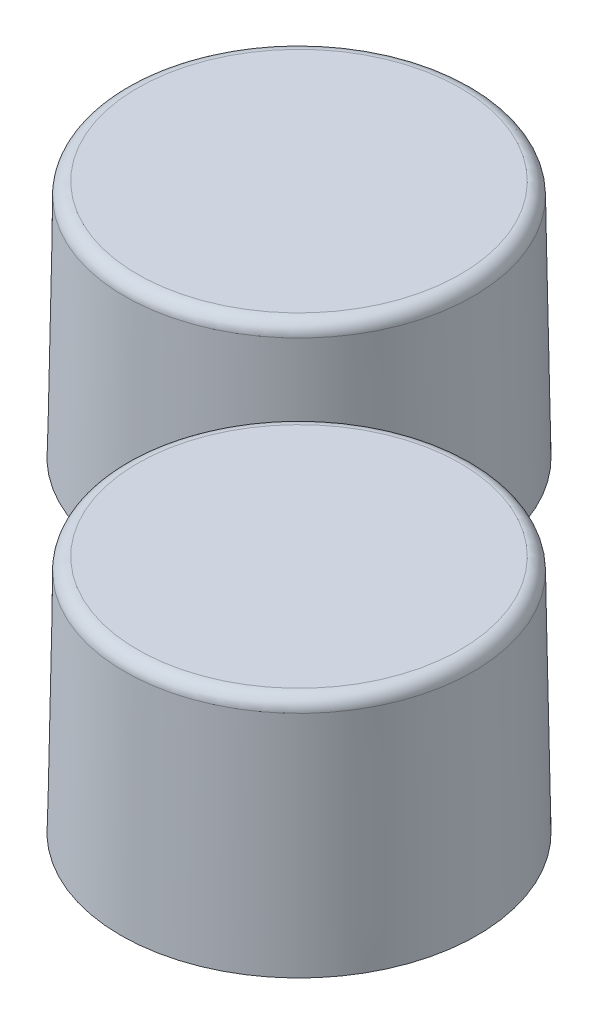
ISO-10303-21;
HEADER;
FILE_DESCRIPTION(('STEP AP214'),'2;1');
FILE_NAME('part.step','',(''),(''),'','','');
FILE_SCHEMA(('AUTOMOTIVE_DESIGN { 1 0 10303 214 1 1 1 1 }'));
ENDSEC;
DATA;
#1=APPLICATION_CONTEXT('core data for automotive mechanical design processes');
#2=APPLICATION_PROTOCOL_DEFINITION('international standard','automotive_design',2000,#1);
#3=PRODUCT_CONTEXT('',#1,'mechanical');
#4=PRODUCT('Part','Part','',(#3));
#5=PRODUCT_RELATED_PRODUCT_CATEGORY('part','',(#4));
#6=PRODUCT_DEFINITION_FORMATION('','',#4);
#7=PRODUCT_DEFINITION_CONTEXT('part definition',#1,'design');
#8=PRODUCT_DEFINITION('design','',#6,#7);
#9=PRODUCT_DEFINITION_SHAPE('','',#8);
#10=(LENGTH_UNIT() NAMED_UNIT(*) SI_UNIT(.MILLI.,.METRE.));
#11=(NAMED_UNIT(*) PLANE_ANGLE_UNIT() SI_UNIT($,.RADIAN.));
#12=(NAMED_UNIT(*) SI_UNIT($,.STERADIAN.) SOLID_ANGLE_UNIT());
#13=UNCERTAINTY_MEASURE_WITH_UNIT(LENGTH_MEASURE(1.E-05),#10,'distance_accuracy_value','');
#14=(GEOMETRIC_REPRESENTATION_CONTEXT(3) GLOBAL_UNCERTAINTY_ASSIGNED_CONTEXT((#13)) GLOBAL_UNIT_ASSIGNED_CONTEXT((#10,
#11,#12)) REPRESENTATION_CONTEXT('',''));
#15=CARTESIAN_POINT('',(0.,0.,0.));
#16=DIRECTION('',(0.,0.,1.));
#17=DIRECTION('',(1.,0.,0.));
#18=AXIS2_PLACEMENT_3D('',#15,#16,#17);
#19=CARTESIAN_POINT('',(138.321064440177,168.143893385275,-208.567623437939));
#20=DIRECTION('',(0.,-1.,0.));
#21=DIRECTION('',(0.,0.,-1.));
#22=AXIS2_PLACEMENT_3D('',#19,#20,#21);
#23=TOROIDAL_SURFACE('',#22,28.54862279739,0.500000000000285);
#24=CARTESIAN_POINT('',(138.321064440177,168.643893385275,-208.567623437939));
#25=DIRECTION('',(0.,-1.,0.));
#26=DIRECTION('',(0.,0.,-1.));
#27=AXIS2_PLACEMENT_3D('',#24,#25,#26);
#28=CIRCLE('',#27,28.5486227973902);
#29=CARTESIAN_POINT('',(138.321064440177,168.643893385275,-237.116246235329));
#30=VERTEX_POINT('',#29);
#31=EDGE_CURVE('E11',#30,#30,#28,.T.);
#32=ORIENTED_EDGE('',*,*,#31,.F.);
#33=EDGE_LOOP('',(#32));
#34=FACE_BOUND('',#33,.T.);
#35=CARTESIAN_POINT('',(138.321064440177,168.152619588494,-208.567623437939));
#36=DIRECTION('',(0.,-1.,0.));
#37=DIRECTION('',(0.,0.,-1.));
#38=AXIS2_PLACEMENT_3D('',#35,#36,#37);
#39=CIRCLE('',#38,29.0485466449685);
#40=CARTESIAN_POINT('',(138.321064440177,168.152619588494,-237.616170082908));
#41=VERTEX_POINT('',#40);
#42=EDGE_CURVE('E65',#41,#41,#39,.T.);
#43=ORIENTED_EDGE('',*,*,#42,.T.);
#44=EDGE_LOOP('',(#43));
#45=FACE_BOUND('',#44,.T.);
#46=ADVANCED_FACE('F43',(#34,#45),#23,.F.);
#47=CARTESIAN_POINT('',(158.507989213749,168.643893385275,-188.380698664368));
#48=DIRECTION('',(0.,1.,0.));
#49=DIRECTION('',(0.,0.,1.));
#50=AXIS2_PLACEMENT_3D('',#47,#48,#49);
#51=PLANE('',#50);
#52=ORIENTED_EDGE('',*,*,#31,.T.);
#53=EDGE_LOOP('',(#52));
#54=FACE_BOUND('',#53,.T.);
#55=ADVANCED_FACE('F95',(#54),#51,.F.);
#56=CARTESIAN_POINT('',(158.507989213749,170.421893385275,-188.380698664367));
#57=DIRECTION('',(0.,-1.,0.));
#58=DIRECTION('',(0.,0.,-1.));
#59=AXIS2_PLACEMENT_3D('',#56,#57,#58);
#60=PLANE('',#59);
#61=CARTESIAN_POINT('',(138.321064440177,170.421893385275,-208.567623437939));
#62=DIRECTION('',(0.,-1.,0.));
#63=DIRECTION('',(0.,0.,-1.));
#64=AXIS2_PLACEMENT_3D('',#61,#62,#63);
#65=CIRCLE('',#64,28.5486227973908);
#66=CARTESIAN_POINT('',(138.321064440177,170.421893385275,-237.11624623533));
#67=VERTEX_POINT('',#66);
#68=EDGE_CURVE('E49',#67,#67,#65,.T.);
#69=ORIENTED_EDGE('',*,*,#68,.F.);
#70=EDGE_LOOP('',(#69));
#71=FACE_BOUND('',#70,.T.);
#72=ADVANCED_FACE('F90',(#71),#60,.F.);
#73=CARTESIAN_POINT('',(138.321064440177,168.143893385275,-208.567623437939));
#74=DIRECTION('',(0.,-1.,0.));
#75=DIRECTION('',(0.,0.,-1.));
#76=AXIS2_PLACEMENT_3D('',#73,#74,#75);
#77=TOROIDAL_SURFACE('',#76,28.54862279739,2.27799999995524);
#78=CARTESIAN_POINT('',(138.321064440177,168.18363376146,-208.567623437939));
#79=DIRECTION('',(0.,-1.,0.));
#80=DIRECTION('',(0.,0.,-1.));
#81=AXIS2_PLACEMENT_3D('',#78,#79,#80);
#82=CIRCLE('',#81,30.826276129725);
#83=CARTESIAN_POINT('',(138.321064440177,168.18363376146,-239.393899567664));
#84=VERTEX_POINT('',#83);
#85=EDGE_CURVE('E53',#84,#84,#82,.T.);
#86=ORIENTED_EDGE('',*,*,#85,.F.);
#87=EDGE_LOOP('',(#86));
#88=FACE_BOUND('',#87,.T.);
#89=ORIENTED_EDGE('',*,*,#68,.T.);
#90=EDGE_LOOP('',(#89));
#91=FACE_BOUND('',#90,.T.);
#92=ADVANCED_FACE('F85',(#88,#91),#77,.T.);
#93=CARTESIAN_POINT('',(138.321064440177,168.18363376146,-208.567623437939));
#94=DIRECTION('',(0.,-1.,0.));
#95=DIRECTION('',(0.,0.,-1.));
#96=AXIS2_PLACEMENT_3D('',#93,#94,#95);
#97=CONICAL_SURFACE('',#96,30.826276129725,0.0174350606355953);
#98=CARTESIAN_POINT('',(138.321064440177,128.094994299908,-208.567623437939));
#99=DIRECTION('',(0.,-1.,0.));
#100=DIRECTION('',(0.,0.,-1.));
#101=AXIS2_PLACEMENT_3D('',#98,#99,#100);
#102=CIRCLE('',#101,31.5252948205171);
#103=CARTESIAN_POINT('',(138.321064440177,128.094994299908,-240.092918258456));
#104=VERTEX_POINT('',#103);
#105=EDGE_CURVE('E57',#104,#104,#102,.T.);
#106=ORIENTED_EDGE('',*,*,#105,.F.);
#107=EDGE_LOOP('',(#106));
#108=FACE_BOUND('',#107,.T.);
#109=ORIENTED_EDGE('',*,*,#85,.T.);
#110=EDGE_LOOP('',(#109));
#111=FACE_BOUND('',#110,.T.);
#112=ADVANCED_FACE('F79',(#108,#111),#97,.T.);
#113=CARTESIAN_POINT('',(138.321064440177,128.094994299908,-208.567623437939));
#114=DIRECTION('',(0.,1.,0.));
#115=DIRECTION('',(0.,0.,1.));
#116=AXIS2_PLACEMENT_3D('',#113,#114,#115);
#117=CONICAL_SURFACE('',#116,31.5252948205171,1.55336126618029);
#118=CARTESIAN_POINT('',(138.321064440177,128.063996332659,-208.567623437939));
#119=DIRECTION('',(0.,-1.,0.));
#120=DIRECTION('',(0.,0.,-1.));
#121=AXIS2_PLACEMENT_3D('',#118,#119,#120);
#122=CIRCLE('',#121,29.7475650530815);
#123=CARTESIAN_POINT('',(138.321064440177,128.063996332659,-238.315188491021));
#124=VERTEX_POINT('',#123);
#125=EDGE_CURVE('E62',#124,#124,#122,.T.);
#126=ORIENTED_EDGE('',*,*,#125,.F.);
#127=EDGE_LOOP('',(#126));
#128=FACE_BOUND('',#127,.T.);
#129=ORIENTED_EDGE('',*,*,#105,.T.);
#130=EDGE_LOOP('',(#129));
#131=FACE_BOUND('',#130,.T.);
#132=ADVANCED_FACE('F73',(#128,#131),#117,.T.);
#133=CARTESIAN_POINT('',(138.321064440177,128.063996332659,-208.567623437939));
#134=DIRECTION('',(0.,-1.,0.));
#135=DIRECTION('',(0.,0.,-1.));
#136=AXIS2_PLACEMENT_3D('',#133,#134,#135);
#137=CONICAL_SURFACE('',#136,29.7475650530815,0.017435060633033);
#138=ORIENTED_EDGE('',*,*,#42,.F.);
#139=EDGE_LOOP('',(#138));
#140=FACE_BOUND('',#139,.T.);
#141=ORIENTED_EDGE('',*,*,#125,.T.);
#142=EDGE_LOOP('',(#141));
#143=FACE_BOUND('',#142,.T.);
#144=ADVANCED_FACE('F70',(#140,#143),#137,.F.);
#145=CLOSED_SHELL('',(#46,#55,#72,#92,#112,#132,#144));
#146=MANIFOLD_SOLID_BREP('B2',#145);
#147=CARTESIAN_POINT('',(195.803172814651,168.143893385275,-151.085515063465));
#148=DIRECTION('',(0.,-1.,0.));
#149=DIRECTION('',(0.,0.,-1.));
#150=AXIS2_PLACEMENT_3D('',#147,#148,#149);
#151=TOROIDAL_SURFACE('',#150,28.5486227973901,0.500000000000204);
#152=CARTESIAN_POINT('',(195.803172814651,168.643893385275,-151.085515063465));
#153=DIRECTION('',(0.,-1.,0.));
#154=DIRECTION('',(0.,0.,-1.));
#155=AXIS2_PLACEMENT_3D('',#152,#153,#154);
#156=CIRCLE('',#155,28.5486227973902);
#157=CARTESIAN_POINT('',(195.803172814651,168.643893385275,-179.634137860856));
#158=VERTEX_POINT('',#157);
#159=EDGE_CURVE('E179',#158,#158,#156,.T.);
#160=ORIENTED_EDGE('',*,*,#159,.F.);
#161=EDGE_LOOP('',(#160));
#162=FACE_BOUND('',#161,.T.);
#163=CARTESIAN_POINT('',(195.803172814651,168.152619588494,-151.085515063465));
#164=DIRECTION('',(0.,-1.,0.));
#165=DIRECTION('',(0.,0.,-1.));
#166=AXIS2_PLACEMENT_3D('',#163,#164,#165);
#167=CIRCLE('',#166,29.0485466449685);
#168=CARTESIAN_POINT('',(195.803172814651,168.152619588494,-180.134061708434));
#169=VERTEX_POINT('',#168);
#170=EDGE_CURVE('E42',#169,#169,#167,.T.);
#171=ORIENTED_EDGE('',*,*,#170,.T.);
#172=EDGE_LOOP('',(#171));
#173=FACE_BOUND('',#172,.T.);
#174=ADVANCED_FACE('F157',(#162,#173),#151,.F.);
#175=CARTESIAN_POINT('',(195.803172814651,128.120491889829,-151.085515063465));
#176=DIRECTION('',(0.,-1.,0.));
#177=DIRECTION('',(0.,0.,-1.));
#178=AXIS2_PLACEMENT_3D('',#175,#176,#177);
#179=CONICAL_SURFACE('',#178,29.7473100331751,0.0174532925202364);
#180=ORIENTED_EDGE('',*,*,#170,.F.);
#181=EDGE_LOOP('',(#180));
#182=FACE_BOUND('',#181,.T.);
#183=CARTESIAN_POINT('',(195.803172814651,128.120491889829,-151.085515063465));
#184=DIRECTION('',(0.,-1.,0.));
#185=DIRECTION('',(0.,0.,-1.));
#186=AXIS2_PLACEMENT_3D('',#183,#184,#185);
#187=CIRCLE('',#186,29.7473100331751);
#188=CARTESIAN_POINT('',(195.803172814651,128.120491889829,-180.83282509664));
#189=VERTEX_POINT('',#188);
#190=EDGE_CURVE('E163',#189,#189,#187,.T.);
#191=ORIENTED_EDGE('',*,*,#190,.T.);
#192=EDGE_LOOP('',(#191));
#193=FACE_BOUND('',#192,.T.);
#194=ADVANCED_FACE('F186',(#182,#193),#179,.F.);
#195=CARTESIAN_POINT('',(195.803172814651,128.151522268475,-151.085515063465));
#196=DIRECTION('',(0.,1.,0.));
#197=DIRECTION('',(0.,0.,1.));
#198=AXIS2_PLACEMENT_3D('',#195,#196,#197);
#199=CONICAL_SURFACE('',#198,31.5250392351631,1.55334303427466);
#200=ORIENTED_EDGE('',*,*,#190,.F.);
#201=EDGE_LOOP('',(#200));
#202=FACE_BOUND('',#201,.T.);
#203=CARTESIAN_POINT('',(195.803172814651,128.151522268475,-151.085515063465));
#204=DIRECTION('',(0.,-1.,0.));
#205=DIRECTION('',(0.,0.,-1.));
#206=AXIS2_PLACEMENT_3D('',#203,#204,#205);
#207=CIRCLE('',#206,31.5250392351631);
#208=CARTESIAN_POINT('',(195.803172814651,128.151522268475,-182.610554298628));
#209=VERTEX_POINT('',#208);
#210=EDGE_CURVE('E167',#209,#209,#207,.T.);
#211=ORIENTED_EDGE('',*,*,#210,.T.);
#212=EDGE_LOOP('',(#211));
#213=FACE_BOUND('',#212,.T.);
#214=ADVANCED_FACE('F190',(#202,#213),#199,.T.);
#215=CARTESIAN_POINT('',(195.803172814651,168.18364996714,-151.085515063465));
#216=DIRECTION('',(0.,-1.,0.));
#217=DIRECTION('',(0.,0.,-1.));
#218=AXIS2_PLACEMENT_3D('',#215,#216,#217);
#219=CONICAL_SURFACE('',#218,30.8262758469565,0.0174532925202357);
#220=ORIENTED_EDGE('',*,*,#210,.F.);
#221=EDGE_LOOP('',(#220));
#222=FACE_BOUND('',#221,.T.);
#223=CARTESIAN_POINT('',(195.803172814651,168.18364996714,-151.085515063465));
#224=DIRECTION('',(0.,-1.,0.));
#225=DIRECTION('',(0.,0.,-1.));
#226=AXIS2_PLACEMENT_3D('',#223,#224,#225);
#227=CIRCLE('',#226,30.8262758469565);
#228=CARTESIAN_POINT('',(195.803172814651,168.18364996714,-181.911790910422));
#229=VERTEX_POINT('',#228);
#230=EDGE_CURVE('E171',#229,#229,#227,.T.);
#231=ORIENTED_EDGE('',*,*,#230,.T.);
#232=EDGE_LOOP('',(#231));
#233=FACE_BOUND('',#232,.T.);
#234=ADVANCED_FACE('F195',(#222,#233),#219,.T.);
#235=CARTESIAN_POINT('',(195.803172814651,168.143893385275,-151.085515063465));
#236=DIRECTION('',(0.,-1.,0.));
#237=DIRECTION('',(0.,0.,-1.));
#238=AXIS2_PLACEMENT_3D('',#235,#236,#237);
#239=TOROIDAL_SURFACE('',#238,28.5486227973901,2.27800000000021);
#240=ORIENTED_EDGE('',*,*,#230,.F.);
#241=EDGE_LOOP('',(#240));
#242=FACE_BOUND('',#241,.T.);
#243=CARTESIAN_POINT('',(195.803172814651,170.421893385275,-151.085515063465));
#244=DIRECTION('',(0.,-1.,0.));
#245=DIRECTION('',(0.,0.,-1.));
#246=AXIS2_PLACEMENT_3D('',#243,#244,#245);
#247=CIRCLE('',#246,28.5486227973906);
#248=CARTESIAN_POINT('',(195.803172814651,170.421893385275,-179.634137860856));
#249=VERTEX_POINT('',#248);
#250=EDGE_CURVE('E176',#249,#249,#247,.T.);
#251=ORIENTED_EDGE('',*,*,#250,.T.);
#252=EDGE_LOOP('',(#251));
#253=FACE_BOUND('',#252,.T.);
#254=ADVANCED_FACE('F201',(#242,#253),#239,.T.);
#255=CARTESIAN_POINT('',(215.990097588223,170.421893385275,-130.898590289894));
#256=DIRECTION('',(0.,-1.,0.));
#257=DIRECTION('',(0.,0.,-1.));
#258=AXIS2_PLACEMENT_3D('',#255,#256,#257);
#259=PLANE('',#258);
#260=ORIENTED_EDGE('',*,*,#250,.F.);
#261=EDGE_LOOP('',(#260));
#262=FACE_BOUND('',#261,.T.);
#263=ADVANCED_FACE('F205',(#262),#259,.F.);
#264=CARTESIAN_POINT('',(215.990097588223,168.643893385275,-130.898590289894));
#265=DIRECTION('',(0.,1.,0.));
#266=DIRECTION('',(0.,0.,1.));
#267=AXIS2_PLACEMENT_3D('',#264,#265,#266);
#268=PLANE('',#267);
#269=ORIENTED_EDGE('',*,*,#159,.T.);
#270=EDGE_LOOP('',(#269));
#271=FACE_BOUND('',#270,.T.);
#272=ADVANCED_FACE('F183',(#271),#268,.F.);
#273=CLOSED_SHELL('',(#174,#194,#214,#234,#254,#263,#272));
#274=MANIFOLD_SOLID_BREP('B6',#273);
#275=ADVANCED_BREP_SHAPE_REPRESENTATION('',(#18,#146,#274),#14);
#276=SHAPE_DEFINITION_REPRESENTATION(#9,#275);
ENDSEC;
END-ISO-10303-21;
